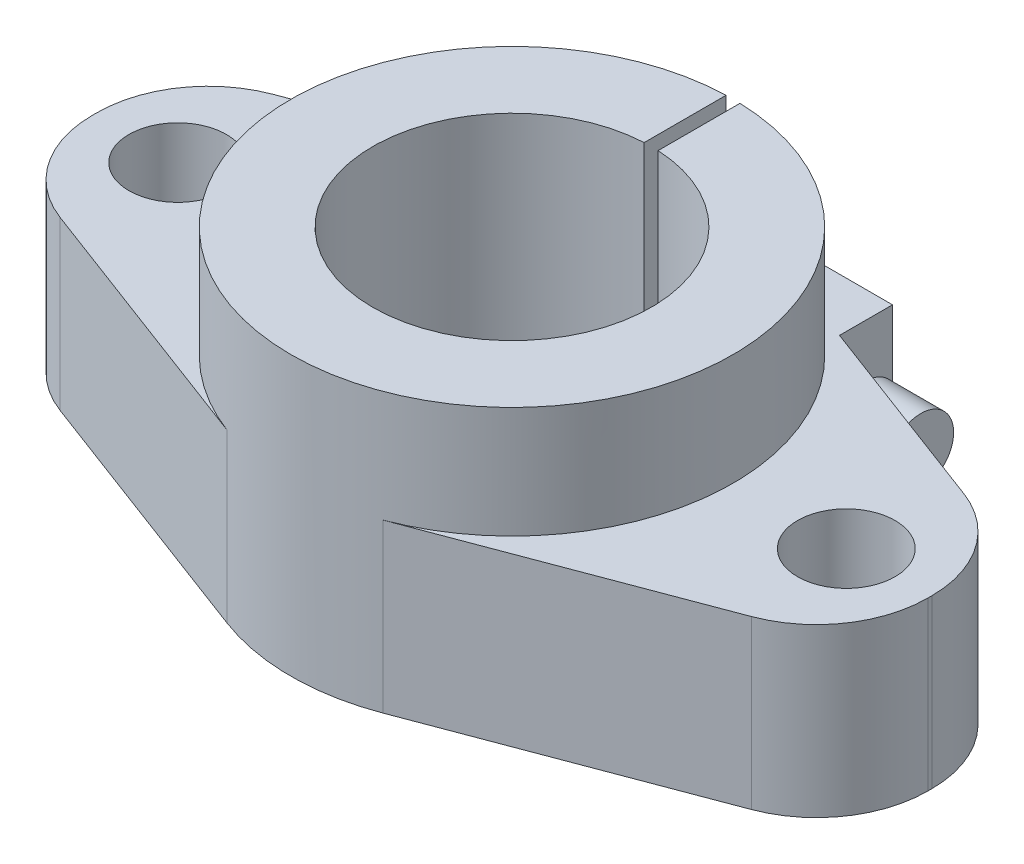
ISO-10303-21;
HEADER;
FILE_DESCRIPTION(('STEP AP214'),'2;1');
FILE_NAME('part.step','',(''),(''),'','','');
FILE_SCHEMA(('AUTOMOTIVE_DESIGN { 1 0 10303 214 1 1 1 1 }'));
ENDSEC;
DATA;
#1=APPLICATION_CONTEXT('core data for automotive mechanical design processes');
#2=APPLICATION_PROTOCOL_DEFINITION('international standard','automotive_design',2000,#1);
#3=PRODUCT_CONTEXT('',#1,'mechanical');
#4=PRODUCT('Part','Part','',(#3));
#5=PRODUCT_RELATED_PRODUCT_CATEGORY('part','',(#4));
#6=PRODUCT_DEFINITION_FORMATION('','',#4);
#7=PRODUCT_DEFINITION_CONTEXT('part definition',#1,'design');
#8=PRODUCT_DEFINITION('design','',#6,#7);
#9=PRODUCT_DEFINITION_SHAPE('','',#8);
#10=(LENGTH_UNIT() NAMED_UNIT(*) SI_UNIT(.MILLI.,.METRE.));
#11=(NAMED_UNIT(*) PLANE_ANGLE_UNIT() SI_UNIT($,.RADIAN.));
#12=(NAMED_UNIT(*) SI_UNIT($,.STERADIAN.) SOLID_ANGLE_UNIT());
#13=UNCERTAINTY_MEASURE_WITH_UNIT(LENGTH_MEASURE(1.E-05),#10,'distance_accuracy_value','');
#14=(GEOMETRIC_REPRESENTATION_CONTEXT(3) GLOBAL_UNCERTAINTY_ASSIGNED_CONTEXT((#13)) GLOBAL_UNIT_ASSIGNED_CONTEXT((#10,
#11,#12)) REPRESENTATION_CONTEXT('',''));
#15=CARTESIAN_POINT('',(0.,0.,0.));
#16=DIRECTION('',(0.,0.,1.));
#17=DIRECTION('',(1.,0.,0.));
#18=AXIS2_PLACEMENT_3D('',#15,#16,#17);
#19=CARTESIAN_POINT('',(5.58771941427111,12.,-14.859757658768));
#20=DIRECTION('',(-0.351968791720276,0.,0.936011735853226));
#21=DIRECTION('',(0.936011735853226,0.,0.351968791720276));
#22=AXIS2_PLACEMENT_3D('',#19,#20,#21);
#23=PLANE('',#22);
#24=CARTESIAN_POINT('',(5.62696028074298,5.86728456422639,-14.8450019032265));
#25=DIRECTION('',(-0.351968791720276,0.,0.936011735853226));
#26=DIRECTION('',(-0.936011735853226,0.,-0.351968791720276));
#27=AXIS2_PLACEMENT_3D('',#24,#25,#26);
#28=ELLIPSE('',#27,6.70619335587779,2.36037077251084);
#29=CARTESIAN_POINT('',(10.4988203862888,7.35565504603659,-13.0130347930961));
#30=VERTEX_POINT('',#29);
#31=CARTESIAN_POINT('',(10.4988203862888,4.3789140824162,-13.0130347930961));
#32=VERTEX_POINT('',#31);
#33=EDGE_CURVE('E316',#30,#32,#28,.F.);
#34=ORIENTED_EDGE('',*,*,#33,.F.);
#35=DIRECTION('',(0.,-1.,0.));
#36=VECTOR('',#35,1.);
#37=CARTESIAN_POINT('',(10.4988203862888,12.,-13.0130347930961));
#38=LINE('',#37,#36);
#39=CARTESIAN_POINT('',(10.4988203862888,12.,-13.0130347930961));
#40=VERTEX_POINT('',#39);
#41=EDGE_CURVE('E205',#40,#30,#38,.T.);
#42=ORIENTED_EDGE('',*,*,#41,.F.);
#43=DIRECTION('',(-0.936011735853226,0.,-0.351968791720276));
#44=VECTOR('',#43,1.);
#45=CARTESIAN_POINT('',(5.58771941427111,12.,-14.859757658768));
#46=LINE('',#45,#44);
#47=CARTESIAN_POINT('',(24.8157503337622,12.,-7.62943505632293));
#48=VERTEX_POINT('',#47);
#49=EDGE_CURVE('E418',#48,#40,#46,.T.);
#50=ORIENTED_EDGE('',*,*,#49,.F.);
#51=DIRECTION('',(0.,-1.,0.));
#52=VECTOR('',#51,1.);
#53=CARTESIAN_POINT('',(24.8157503337622,12.,-7.62943505632293));
#54=LINE('',#53,#52);
#55=CARTESIAN_POINT('',(24.8157503337622,0.,-7.62943505632293));
#56=VERTEX_POINT('',#55);
#57=EDGE_CURVE('E381',#48,#56,#54,.T.);
#58=ORIENTED_EDGE('',*,*,#57,.T.);
#59=DIRECTION('',(-0.936011735853226,0.,-0.351968791720276));
#60=VECTOR('',#59,1.);
#61=CARTESIAN_POINT('',(5.58771941427111,0.,-14.859757658768));
#62=LINE('',#61,#60);
#63=CARTESIAN_POINT('',(10.4988203862888,0.,-13.0130347930961));
#64=VERTEX_POINT('',#63);
#65=EDGE_CURVE('E255',#56,#64,#62,.T.);
#66=ORIENTED_EDGE('',*,*,#65,.T.);
#67=EDGE_CURVE('E213',#32,#64,#38,.T.);
#68=ORIENTED_EDGE('',*,*,#67,.F.);
#69=EDGE_LOOP('',(#34,#42,#50,#58,#66,#68));
#70=FACE_BOUND('',#69,.T.);
#71=ADVANCED_FACE('F34',(#70),#23,.F.);
#72=CARTESIAN_POINT('',(10.4988203862888,12.,0.));
#73=DIRECTION('',(1.,0.,0.));
#74=DIRECTION('',(0.,0.,-1.));
#75=AXIS2_PLACEMENT_3D('',#72,#73,#74);
#76=PLANE('',#75);
#77=DIRECTION('',(0.,-1.,0.));
#78=VECTOR('',#77,1.);
#79=CARTESIAN_POINT('',(10.4988203862888,12.,-16.8162644471082));
#80=LINE('',#79,#78);
#81=CARTESIAN_POINT('',(10.4988203862888,4.56902643626694,-16.8162644471082));
#82=VERTEX_POINT('',#81);
#83=CARTESIAN_POINT('',(10.4988203862888,0.,-16.8162644471082));
#84=VERTEX_POINT('',#83);
#85=EDGE_CURVE('E192',#82,#84,#80,.T.);
#86=ORIENTED_EDGE('',*,*,#85,.F.);
#87=CARTESIAN_POINT('',(10.4988203862888,5.86728456422639,-14.8450019032265));
#88=DIRECTION('',(1.,0.,0.));
#89=DIRECTION('',(0.,0.,-1.));
#90=AXIS2_PLACEMENT_3D('',#87,#88,#89);
#91=CIRCLE('',#90,2.36037077251084);
#92=EDGE_CURVE('E49',#32,#82,#91,.T.);
#93=ORIENTED_EDGE('',*,*,#92,.F.);
#94=ORIENTED_EDGE('',*,*,#67,.T.);
#95=DIRECTION('',(0.,0.,1.));
#96=VECTOR('',#95,1.);
#97=CARTESIAN_POINT('',(10.4988203862888,0.,0.));
#98=LINE('',#97,#96);
#99=EDGE_CURVE('E252',#84,#64,#98,.T.);
#100=ORIENTED_EDGE('',*,*,#99,.F.);
#101=EDGE_LOOP('',(#86,#93,#94,#100));
#102=FACE_BOUND('',#101,.T.);
#103=ADVANCED_FACE('F465',(#102),#76,.T.);
#104=ORIENTED_EDGE('',*,*,#41,.T.);
#105=CARTESIAN_POINT('',(10.4988203862888,7.16554269218584,-16.8162644471082));
#106=VERTEX_POINT('',#105);
#107=EDGE_CURVE('E196',#106,#30,#91,.T.);
#108=ORIENTED_EDGE('',*,*,#107,.F.);
#109=CARTESIAN_POINT('',(10.4988203862888,12.,-16.8162644471082));
#110=VERTEX_POINT('',#109);
#111=EDGE_CURVE('E191',#110,#106,#80,.T.);
#112=ORIENTED_EDGE('',*,*,#111,.F.);
#113=DIRECTION('',(0.,0.,1.));
#114=VECTOR('',#113,1.);
#115=CARTESIAN_POINT('',(10.4988203862888,12.,0.));
#116=LINE('',#115,#114);
#117=EDGE_CURVE('E420',#110,#40,#116,.T.);
#118=ORIENTED_EDGE('',*,*,#117,.T.);
#119=EDGE_LOOP('',(#104,#108,#112,#118));
#120=FACE_BOUND('',#119,.T.);
#121=ADVANCED_FACE('F201',(#120),#76,.T.);
#122=CARTESIAN_POINT('',(0.,12.,0.));
#123=DIRECTION('',(0.,1.,0.));
#124=DIRECTION('',(0.,0.,1.));
#125=AXIS2_PLACEMENT_3D('',#122,#123,#124);
#126=PLANE('',#125);
#127=DIRECTION('',(0.,0.,-1.));
#128=VECTOR('',#127,1.);
#129=CARTESIAN_POINT('',(-30.,12.,0.));
#130=LINE('',#129,#128);
#131=CARTESIAN_POINT('',(-30.,12.,0.140757034775283));
#132=VERTEX_POINT('',#131);
#133=CARTESIAN_POINT('',(-30.,12.,-0.182302427989566));
#134=VERTEX_POINT('',#133);
#135=EDGE_CURVE('E398',#132,#134,#130,.T.);
#136=ORIENTED_EDGE('',*,*,#135,.F.);
#137=CARTESIAN_POINT('',(-22.,12.,0.140757034775283));
#138=DIRECTION('',(0.,1.,0.));
#139=DIRECTION('',(0.,0.,1.));
#140=AXIS2_PLACEMENT_3D('',#137,#138,#139);
#141=CIRCLE('',#140,8.);
#142=CARTESIAN_POINT('',(-24.8159496339808,12.,7.62877597564898));
#143=VERTEX_POINT('',#142);
#144=EDGE_CURVE('E42',#132,#143,#141,.T.);
#145=ORIENTED_EDGE('',*,*,#144,.T.);
#146=DIRECTION('',(-0.936002367609212,0.,-0.351993704247604));
#147=VECTOR('',#146,1.);
#148=CARTESIAN_POINT('',(-5.58811491584933,12.,14.8596089321758));
#149=LINE('',#148,#147);
#150=CARTESIAN_POINT('',(-5.58811491584933,12.,14.8596089321758));
#151=VERTEX_POINT('',#150);
#152=EDGE_CURVE('E377',#151,#143,#149,.T.);
#153=ORIENTED_EDGE('',*,*,#152,.F.);
#154=CARTESIAN_POINT('',(0.,12.,0.));
#155=DIRECTION('',(0.,1.,0.));
#156=DIRECTION('',(0.,0.,1.));
#157=AXIS2_PLACEMENT_3D('',#154,#155,#156);
#158=CIRCLE('',#157,15.8756104112546);
#159=CARTESIAN_POINT('',(-0.5,12.,-15.867734744756));
#160=VERTEX_POINT('',#159);
#161=EDGE_CURVE('E311',#160,#151,#158,.T.);
#162=ORIENTED_EDGE('',*,*,#161,.F.);
#163=DIRECTION('',(0.,0.,1.));
#164=VECTOR('',#163,1.);
#165=CARTESIAN_POINT('',(-0.5,12.,0.));
#166=LINE('',#165,#164);
#167=CARTESIAN_POINT('',(-0.5,12.,-16.8162644471082));
#168=VERTEX_POINT('',#167);
#169=EDGE_CURVE('E285',#168,#160,#166,.T.);
#170=ORIENTED_EDGE('',*,*,#169,.F.);
#171=DIRECTION('',(-1.,0.,0.));
#172=VECTOR('',#171,1.);
#173=CARTESIAN_POINT('',(0.,12.,-16.8162644471082));
#174=LINE('',#173,#172);
#175=CARTESIAN_POINT('',(-10.5,12.,-16.8162644471082));
#176=VERTEX_POINT('',#175);
#177=EDGE_CURVE('E283',#168,#176,#174,.T.);
#178=ORIENTED_EDGE('',*,*,#177,.T.);
#179=DIRECTION('',(0.,0.,1.));
#180=VECTOR('',#179,1.);
#181=CARTESIAN_POINT('',(-10.5,12.,0.));
#182=LINE('',#181,#180);
#183=CARTESIAN_POINT('',(-10.5,12.,-13.0230815952437));
#184=VERTEX_POINT('',#183);
#185=EDGE_CURVE('E234',#176,#184,#182,.T.);
#186=ORIENTED_EDGE('',*,*,#185,.T.);
#187=DIRECTION('',(-0.93666723836858,0.,0.350220622703715));
#188=VECTOR('',#187,1.);
#189=CARTESIAN_POINT('',(-5.55996616403117,12.,-14.8701641613253));
#190=LINE('',#189,#188);
#191=CARTESIAN_POINT('',(-24.8017649816297,12.,-7.6756403349382));
#192=VERTEX_POINT('',#191);
#193=EDGE_CURVE('E411',#184,#192,#190,.T.);
#194=ORIENTED_EDGE('',*,*,#193,.T.);
#195=CARTESIAN_POINT('',(-22.,12.,-0.182302427989566));
#196=DIRECTION('',(0.,1.,0.));
#197=DIRECTION('',(0.,0.,1.));
#198=AXIS2_PLACEMENT_3D('',#195,#196,#197);
#199=CIRCLE('',#198,8.);
#200=EDGE_CURVE('E392',#192,#134,#199,.T.);
#201=ORIENTED_EDGE('',*,*,#200,.T.);
#202=EDGE_LOOP('',(#136,#145,#153,#162,#170,#178,#186,#194,#201));
#203=FACE_BOUND('',#202,.T.);
#204=CARTESIAN_POINT('',(-24.,12.,0.));
#205=DIRECTION('',(0.,1.,0.));
#206=DIRECTION('',(0.,0.,1.));
#207=AXIS2_PLACEMENT_3D('',#204,#205,#206);
#208=CIRCLE('',#207,3.5);
#209=CARTESIAN_POINT('',(-24.,12.,3.5));
#210=VERTEX_POINT('',#209);
#211=EDGE_CURVE('E230',#210,#210,#208,.T.);
#212=ORIENTED_EDGE('',*,*,#211,.F.);
#213=EDGE_LOOP('',(#212));
#214=FACE_BOUND('',#213,.T.);
#215=ADVANCED_FACE('F395',(#203,#214),#126,.T.);
#216=CARTESIAN_POINT('',(-10.5,12.,0.));
#217=DIRECTION('',(1.,0.,0.));
#218=DIRECTION('',(0.,0.,-1.));
#219=AXIS2_PLACEMENT_3D('',#216,#217,#218);
#220=PLANE('',#219);
#221=DIRECTION('',(0.,0.,1.));
#222=VECTOR('',#221,1.);
#223=CARTESIAN_POINT('',(-10.5,0.,0.));
#224=LINE('',#223,#222);
#225=CARTESIAN_POINT('',(-10.5,0.,-16.8162644471082));
#226=VERTEX_POINT('',#225);
#227=CARTESIAN_POINT('',(-10.5,0.,-13.0230815952437));
#228=VERTEX_POINT('',#227);
#229=EDGE_CURVE('E274',#226,#228,#224,.T.);
#230=ORIENTED_EDGE('',*,*,#229,.T.);
#231=DIRECTION('',(0.,-1.,0.));
#232=VECTOR('',#231,1.);
#233=CARTESIAN_POINT('',(-10.5,12.,-13.0230815952437));
#234=LINE('',#233,#232);
#235=EDGE_CURVE('E301',#184,#228,#234,.T.);
#236=ORIENTED_EDGE('',*,*,#235,.F.);
#237=ORIENTED_EDGE('',*,*,#185,.F.);
#238=DIRECTION('',(0.,-1.,0.));
#239=VECTOR('',#238,1.);
#240=CARTESIAN_POINT('',(-10.5,12.,-16.8162644471082));
#241=LINE('',#240,#239);
#242=EDGE_CURVE('E227',#176,#226,#241,.T.);
#243=ORIENTED_EDGE('',*,*,#242,.T.);
#244=EDGE_LOOP('',(#230,#236,#237,#243));
#245=FACE_BOUND('',#244,.T.);
#246=ADVANCED_FACE('F488',(#245),#220,.F.);
#247=CARTESIAN_POINT('',(-5.55996616403117,12.,-14.8701641613253));
#248=DIRECTION('',(0.350220622703715,0.,0.93666723836858));
#249=DIRECTION('',(0.93666723836858,0.,-0.350220622703715));
#250=AXIS2_PLACEMENT_3D('',#247,#248,#249);
#251=PLANE('',#250);
#252=DIRECTION('',(-0.93666723836858,0.,0.350220622703715));
#253=VECTOR('',#252,1.);
#254=CARTESIAN_POINT('',(-5.55996616403117,0.,-14.8701641613253));
#255=LINE('',#254,#253);
#256=CARTESIAN_POINT('',(-24.8017649816297,0.,-7.6756403349382));
#257=VERTEX_POINT('',#256);
#258=EDGE_CURVE('E272',#228,#257,#255,.T.);
#259=ORIENTED_EDGE('',*,*,#258,.T.);
#260=DIRECTION('',(0.,-1.,0.));
#261=VECTOR('',#260,1.);
#262=CARTESIAN_POINT('',(-24.8017649816297,12.,-7.67564033493821));
#263=LINE('',#262,#261);
#264=EDGE_CURVE('E11',#257,#192,#263,.F.);
#265=ORIENTED_EDGE('',*,*,#264,.T.);
#266=ORIENTED_EDGE('',*,*,#193,.F.);
#267=ORIENTED_EDGE('',*,*,#235,.T.);
#268=EDGE_LOOP('',(#259,#265,#266,#267));
#269=FACE_BOUND('',#268,.T.);
#270=ADVANCED_FACE('F407',(#269),#251,.F.);
#271=CARTESIAN_POINT('',(-30.,12.,0.));
#272=DIRECTION('',(-1.,0.,0.));
#273=DIRECTION('',(0.,0.,1.));
#274=AXIS2_PLACEMENT_3D('',#271,#272,#273);
#275=PLANE('',#274);
#276=DIRECTION('',(0.,0.,-1.));
#277=VECTOR('',#276,1.);
#278=CARTESIAN_POINT('',(-30.,0.,0.));
#279=LINE('',#278,#277);
#280=CARTESIAN_POINT('',(-30.,0.,0.140757034775283));
#281=VERTEX_POINT('',#280);
#282=CARTESIAN_POINT('',(-30.,0.,-0.182302427989566));
#283=VERTEX_POINT('',#282);
#284=EDGE_CURVE('E269',#281,#283,#279,.T.);
#285=ORIENTED_EDGE('',*,*,#284,.F.);
#286=DIRECTION('',(0.,-1.,0.));
#287=VECTOR('',#286,1.);
#288=CARTESIAN_POINT('',(-30.,12.,0.140757034775283));
#289=LINE('',#288,#287);
#290=EDGE_CURVE('E384',#281,#132,#289,.F.);
#291=ORIENTED_EDGE('',*,*,#290,.T.);
#292=ORIENTED_EDGE('',*,*,#135,.T.);
#293=DIRECTION('',(0.,-1.,0.));
#294=VECTOR('',#293,1.);
#295=CARTESIAN_POINT('',(-30.,0.,-0.182302427989566));
#296=LINE('',#295,#294);
#297=EDGE_CURVE('E380',#134,#283,#296,.T.);
#298=ORIENTED_EDGE('',*,*,#297,.T.);
#299=EDGE_LOOP('',(#285,#291,#292,#298));
#300=FACE_BOUND('',#299,.T.);
#301=ADVANCED_FACE('F403',(#300),#275,.T.);
#302=CARTESIAN_POINT('',(-5.58811491584933,12.,14.8596089321758));
#303=DIRECTION('',(-0.351993704247604,0.,0.936002367609212));
#304=DIRECTION('',(0.936002367609212,0.,0.351993704247604));
#305=AXIS2_PLACEMENT_3D('',#302,#303,#304);
#306=PLANE('',#305);
#307=ORIENTED_EDGE('',*,*,#152,.T.);
#308=DIRECTION('',(0.,-1.,0.));
#309=VECTOR('',#308,1.);
#310=CARTESIAN_POINT('',(-24.8159496339808,12.,7.62877597564898));
#311=LINE('',#310,#309);
#312=CARTESIAN_POINT('',(-24.8159496339808,0.,7.62877597564898));
#313=VERTEX_POINT('',#312);
#314=EDGE_CURVE('E376',#143,#313,#311,.T.);
#315=ORIENTED_EDGE('',*,*,#314,.T.);
#316=DIRECTION('',(-0.936002367609212,0.,-0.351993704247604));
#317=VECTOR('',#316,1.);
#318=CARTESIAN_POINT('',(-5.58811491584933,0.,14.8596089321758));
#319=LINE('',#318,#317);
#320=CARTESIAN_POINT('',(-5.58200011721561,0.,14.8619077496465));
#321=VERTEX_POINT('',#320);
#322=EDGE_CURVE('E266',#321,#313,#319,.T.);
#323=ORIENTED_EDGE('',*,*,#322,.F.);
#324=DIRECTION('',(0.,-1.,0.));
#325=VECTOR('',#324,1.);
#326=CARTESIAN_POINT('',(-5.58200011721561,12.,14.8619077496465));
#327=LINE('',#326,#325);
#328=CARTESIAN_POINT('',(-5.58200011721561,12.,14.8619077496465));
#329=VERTEX_POINT('',#328);
#330=EDGE_CURVE('E348',#329,#321,#327,.T.);
#331=ORIENTED_EDGE('',*,*,#330,.F.);
#332=EDGE_CURVE('E317',#329,#151,#149,.T.);
#333=ORIENTED_EDGE('',*,*,#332,.T.);
#334=EDGE_LOOP('',(#307,#315,#323,#331,#333));
#335=FACE_BOUND('',#334,.T.);
#336=ADVANCED_FACE('F373',(#335),#306,.T.);
#337=CARTESIAN_POINT('',(0.,12.,0.));
#338=DIRECTION('',(0.,-1.,0.));
#339=DIRECTION('',(0.,0.,-1.));
#340=AXIS2_PLACEMENT_3D('',#337,#338,#339);
#341=CYLINDRICAL_SURFACE('',#340,15.8756104112546);
#342=CARTESIAN_POINT('',(0.,0.,0.));
#343=DIRECTION('',(0.,1.,0.));
#344=DIRECTION('',(0.,0.,1.));
#345=AXIS2_PLACEMENT_3D('',#342,#343,#344);
#346=CIRCLE('',#345,15.8756104112546);
#347=CARTESIAN_POINT('',(5.58811491584933,0.,14.8596089321758));
#348=VERTEX_POINT('',#347);
#349=EDGE_CURVE('E263',#321,#348,#346,.T.);
#350=ORIENTED_EDGE('',*,*,#349,.T.);
#351=DIRECTION('',(0.,-1.,0.));
#352=VECTOR('',#351,1.);
#353=CARTESIAN_POINT('',(5.58811491584933,12.,14.8596089321758));
#354=LINE('',#353,#352);
#355=CARTESIAN_POINT('',(5.58811491584933,12.,14.8596089321758));
#356=VERTEX_POINT('',#355);
#357=EDGE_CURVE('E349',#356,#348,#354,.T.);
#358=ORIENTED_EDGE('',*,*,#357,.F.);
#359=CARTESIAN_POINT('',(0.5,12.,-15.867735080936));
#360=VERTEX_POINT('',#359);
#361=EDGE_CURVE('E296',#356,#360,#158,.T.);
#362=ORIENTED_EDGE('',*,*,#361,.T.);
#363=DIRECTION('',(0.,-1.,0.));
#364=VECTOR('',#363,1.);
#365=CARTESIAN_POINT('',(0.5,20.,-15.867735080936));
#366=LINE('',#365,#364);
#367=CARTESIAN_POINT('',(0.5,20.,-15.867735080936));
#368=VERTEX_POINT('',#367);
#369=EDGE_CURVE('E277',#368,#360,#366,.T.);
#370=ORIENTED_EDGE('',*,*,#369,.F.);
#371=CARTESIAN_POINT('',(0.,20.,0.));
#372=DIRECTION('',(0.,1.,0.));
#373=DIRECTION('',(0.,0.,1.));
#374=AXIS2_PLACEMENT_3D('',#371,#372,#373);
#375=CIRCLE('',#374,15.8756104112546);
#376=CARTESIAN_POINT('',(-0.5,20.,-15.867735080936));
#377=VERTEX_POINT('',#376);
#378=EDGE_CURVE('E315',#377,#368,#375,.T.);
#379=ORIENTED_EDGE('',*,*,#378,.F.);
#380=DIRECTION('',(0.,-1.,0.));
#381=VECTOR('',#380,1.);
#382=CARTESIAN_POINT('',(-0.5,20.,-15.867735080936));
#383=LINE('',#382,#381);
#384=EDGE_CURVE('E320',#377,#160,#383,.T.);
#385=ORIENTED_EDGE('',*,*,#384,.T.);
#386=ORIENTED_EDGE('',*,*,#161,.T.);
#387=ORIENTED_EDGE('',*,*,#332,.F.);
#388=ORIENTED_EDGE('',*,*,#330,.T.);
#389=EDGE_LOOP('',(#350,#358,#362,#370,#379,#385,#386,#387,#388));
#390=FACE_BOUND('',#389,.T.);
#391=ADVANCED_FACE('F364',(#390),#341,.T.);
#392=CARTESIAN_POINT('',(5.58811491584933,12.,14.8596089321758));
#393=DIRECTION('',(0.351993704247604,0.,0.936002367609212));
#394=DIRECTION('',(0.936002367609212,0.,-0.351993704247604));
#395=AXIS2_PLACEMENT_3D('',#392,#393,#394);
#396=PLANE('',#395);
#397=DIRECTION('',(-0.936002367609212,0.,0.351993704247604));
#398=VECTOR('',#397,1.);
#399=CARTESIAN_POINT('',(5.58811491584933,0.,14.8596089321758));
#400=LINE('',#399,#398);
#401=CARTESIAN_POINT('',(24.8159496339808,0.,7.62877597564898));
#402=VERTEX_POINT('',#401);
#403=EDGE_CURVE('E261',#402,#348,#400,.T.);
#404=ORIENTED_EDGE('',*,*,#403,.F.);
#405=DIRECTION('',(0.,-1.,0.));
#406=VECTOR('',#405,1.);
#407=CARTESIAN_POINT('',(24.8159496339808,12.,7.62877597564898));
#408=LINE('',#407,#406);
#409=CARTESIAN_POINT('',(24.8159496339808,12.,7.62877597564898));
#410=VERTEX_POINT('',#409);
#411=EDGE_CURVE('E337',#402,#410,#408,.F.);
#412=ORIENTED_EDGE('',*,*,#411,.T.);
#413=DIRECTION('',(-0.936002367609212,0.,0.351993704247604));
#414=VECTOR('',#413,1.);
#415=CARTESIAN_POINT('',(5.58811491584933,12.,14.8596089321758));
#416=LINE('',#415,#414);
#417=EDGE_CURVE('E338',#410,#356,#416,.T.);
#418=ORIENTED_EDGE('',*,*,#417,.T.);
#419=ORIENTED_EDGE('',*,*,#357,.T.);
#420=EDGE_LOOP('',(#404,#412,#418,#419));
#421=FACE_BOUND('',#420,.T.);
#422=ADVANCED_FACE('F360',(#421),#396,.T.);
#423=CARTESIAN_POINT('',(30.,12.,0.));
#424=DIRECTION('',(-1.,0.,0.));
#425=DIRECTION('',(0.,0.,1.));
#426=AXIS2_PLACEMENT_3D('',#423,#424,#425);
#427=PLANE('',#426);
#428=DIRECTION('',(0.,0.,-1.));
#429=VECTOR('',#428,1.);
#430=CARTESIAN_POINT('',(30.,12.,0.));
#431=LINE('',#430,#429);
#432=CARTESIAN_POINT('',(30.,12.,0.140757034775282));
#433=VERTEX_POINT('',#432);
#434=CARTESIAN_POINT('',(30.,12.,-0.141341169497128));
#435=VERTEX_POINT('',#434);
#436=EDGE_CURVE('E341',#433,#435,#431,.T.);
#437=ORIENTED_EDGE('',*,*,#436,.F.);
#438=DIRECTION('',(0.,-1.,0.));
#439=VECTOR('',#438,1.);
#440=CARTESIAN_POINT('',(30.,0.,0.140757034775282));
#441=LINE('',#440,#439);
#442=CARTESIAN_POINT('',(30.,0.,0.140757034775282));
#443=VERTEX_POINT('',#442);
#444=EDGE_CURVE('E326',#433,#443,#441,.T.);
#445=ORIENTED_EDGE('',*,*,#444,.T.);
#446=DIRECTION('',(0.,0.,-1.));
#447=VECTOR('',#446,1.);
#448=CARTESIAN_POINT('',(30.,0.,0.));
#449=LINE('',#448,#447);
#450=CARTESIAN_POINT('',(30.,0.,-0.141341169497128));
#451=VERTEX_POINT('',#450);
#452=EDGE_CURVE('E258',#443,#451,#449,.T.);
#453=ORIENTED_EDGE('',*,*,#452,.T.);
#454=DIRECTION('',(0.,-1.,0.));
#455=VECTOR('',#454,1.);
#456=CARTESIAN_POINT('',(30.,12.,-0.141341169497128));
#457=LINE('',#456,#455);
#458=EDGE_CURVE('E300',#451,#435,#457,.F.);
#459=ORIENTED_EDGE('',*,*,#458,.T.);
#460=EDGE_LOOP('',(#437,#445,#453,#459));
#461=FACE_BOUND('',#460,.T.);
#462=ADVANCED_FACE('F459',(#461),#427,.F.);
#463=CARTESIAN_POINT('',(0.,12.,-16.8162644471082));
#464=DIRECTION('',(0.,0.,-1.));
#465=DIRECTION('',(-1.,0.,0.));
#466=AXIS2_PLACEMENT_3D('',#463,#464,#465);
#467=PLANE('',#466);
#468=DIRECTION('',(1.,0.,0.));
#469=VECTOR('',#468,1.);
#470=CARTESIAN_POINT('',(0.,0.,-16.8162644471082));
#471=LINE('',#470,#469);
#472=CARTESIAN_POINT('',(0.5,0.,-16.8162644471082));
#473=VERTEX_POINT('',#472);
#474=EDGE_CURVE('E249',#473,#84,#471,.T.);
#475=ORIENTED_EDGE('',*,*,#474,.F.);
#476=DIRECTION('',(0.,-1.,0.));
#477=VECTOR('',#476,1.);
#478=CARTESIAN_POINT('',(0.5,12.,-16.8162644471082));
#479=LINE('',#478,#477);
#480=CARTESIAN_POINT('',(0.5,12.,-16.8162644471082));
#481=VERTEX_POINT('',#480);
#482=EDGE_CURVE('E216',#481,#473,#479,.T.);
#483=ORIENTED_EDGE('',*,*,#482,.F.);
#484=DIRECTION('',(1.,0.,0.));
#485=VECTOR('',#484,1.);
#486=CARTESIAN_POINT('',(0.,12.,-16.8162644471082));
#487=LINE('',#486,#485);
#488=EDGE_CURVE('E212',#481,#110,#487,.T.);
#489=ORIENTED_EDGE('',*,*,#488,.T.);
#490=ORIENTED_EDGE('',*,*,#111,.T.);
#491=EDGE_CURVE('E185',#106,#82,#80,.T.);
#492=ORIENTED_EDGE('',*,*,#491,.T.);
#493=ORIENTED_EDGE('',*,*,#85,.T.);
#494=EDGE_LOOP('',(#475,#483,#489,#490,#492,#493));
#495=FACE_BOUND('',#494,.T.);
#496=ADVANCED_FACE('F209',(#495),#467,.T.);
#497=CARTESIAN_POINT('',(0.5,12.,0.));
#498=DIRECTION('',(-1.,0.,0.));
#499=DIRECTION('',(0.,0.,1.));
#500=AXIS2_PLACEMENT_3D('',#497,#498,#499);
#501=PLANE('',#500);
#502=DIRECTION('',(0.,0.,-1.));
#503=VECTOR('',#502,1.);
#504=CARTESIAN_POINT('',(0.5,0.,0.));
#505=LINE('',#504,#503);
#506=CARTESIAN_POINT('',(0.5,0.,-9.98749217771909));
#507=VERTEX_POINT('',#506);
#508=EDGE_CURVE('E246',#507,#473,#505,.T.);
#509=ORIENTED_EDGE('',*,*,#508,.F.);
#510=DIRECTION('',(0.,-1.,0.));
#511=VECTOR('',#510,1.);
#512=CARTESIAN_POINT('',(0.5,12.,-9.98749217771909));
#513=LINE('',#512,#511);
#514=CARTESIAN_POINT('',(0.499999999999997,20.,-9.98749217771909));
#515=VERTEX_POINT('',#514);
#516=EDGE_CURVE('E218',#515,#507,#513,.T.);
#517=ORIENTED_EDGE('',*,*,#516,.F.);
#518=DIRECTION('',(0.,0.,1.));
#519=VECTOR('',#518,1.);
#520=CARTESIAN_POINT('',(0.5,20.,0.));
#521=LINE('',#520,#519);
#522=EDGE_CURVE('E439',#368,#515,#521,.T.);
#523=ORIENTED_EDGE('',*,*,#522,.F.);
#524=ORIENTED_EDGE('',*,*,#369,.T.);
#525=DIRECTION('',(0.,0.,-1.));
#526=VECTOR('',#525,1.);
#527=CARTESIAN_POINT('',(0.5,12.,0.));
#528=LINE('',#527,#526);
#529=EDGE_CURVE('E294',#360,#481,#528,.T.);
#530=ORIENTED_EDGE('',*,*,#529,.T.);
#531=ORIENTED_EDGE('',*,*,#482,.T.);
#532=EDGE_LOOP('',(#509,#517,#523,#524,#530,#531));
#533=FACE_BOUND('',#532,.T.);
#534=ADVANCED_FACE('F422',(#533),#501,.T.);
#535=CARTESIAN_POINT('',(0.,12.,0.));
#536=DIRECTION('',(0.,-1.,0.));
#537=DIRECTION('',(0.,0.,-1.));
#538=AXIS2_PLACEMENT_3D('',#535,#536,#537);
#539=CYLINDRICAL_SURFACE('',#538,10.);
#540=CARTESIAN_POINT('',(0.,0.,0.));
#541=DIRECTION('',(0.,1.,0.));
#542=DIRECTION('',(0.,0.,1.));
#543=AXIS2_PLACEMENT_3D('',#540,#541,#542);
#544=CIRCLE('',#543,10.);
#545=CARTESIAN_POINT('',(-0.5,0.,-9.98749217771909));
#546=VERTEX_POINT('',#545);
#547=EDGE_CURVE('E243',#546,#507,#544,.T.);
#548=ORIENTED_EDGE('',*,*,#547,.F.);
#549=DIRECTION('',(0.,-1.,0.));
#550=VECTOR('',#549,1.);
#551=CARTESIAN_POINT('',(-0.5,12.,-9.98749217771909));
#552=LINE('',#551,#550);
#553=CARTESIAN_POINT('',(-0.5,20.,-9.98749217771909));
#554=VERTEX_POINT('',#553);
#555=EDGE_CURVE('E221',#554,#546,#552,.T.);
#556=ORIENTED_EDGE('',*,*,#555,.F.);
#557=CARTESIAN_POINT('',(0.,20.,0.));
#558=DIRECTION('',(0.,1.,0.));
#559=DIRECTION('',(0.,0.,1.));
#560=AXIS2_PLACEMENT_3D('',#557,#558,#559);
#561=CIRCLE('',#560,10.);
#562=EDGE_CURVE('E441',#515,#554,#561,.F.);
#563=ORIENTED_EDGE('',*,*,#562,.F.);
#564=ORIENTED_EDGE('',*,*,#516,.T.);
#565=EDGE_LOOP('',(#548,#556,#563,#564));
#566=FACE_BOUND('',#565,.T.);
#567=ADVANCED_FACE('F533',(#566),#539,.F.);
#568=CARTESIAN_POINT('',(-0.5,12.,0.));
#569=DIRECTION('',(1.,0.,0.));
#570=DIRECTION('',(0.,0.,-1.));
#571=AXIS2_PLACEMENT_3D('',#568,#569,#570);
#572=PLANE('',#571);
#573=DIRECTION('',(0.,0.,1.));
#574=VECTOR('',#573,1.);
#575=CARTESIAN_POINT('',(-0.5,0.,0.));
#576=LINE('',#575,#574);
#577=CARTESIAN_POINT('',(-0.5,0.,-16.8162644471082));
#578=VERTEX_POINT('',#577);
#579=EDGE_CURVE('E240',#578,#546,#576,.T.);
#580=ORIENTED_EDGE('',*,*,#579,.F.);
#581=DIRECTION('',(0.,-1.,0.));
#582=VECTOR('',#581,1.);
#583=CARTESIAN_POINT('',(-0.5,12.,-16.8162644471082));
#584=LINE('',#583,#582);
#585=EDGE_CURVE('E225',#168,#578,#584,.T.);
#586=ORIENTED_EDGE('',*,*,#585,.F.);
#587=ORIENTED_EDGE('',*,*,#169,.T.);
#588=ORIENTED_EDGE('',*,*,#384,.F.);
#589=DIRECTION('',(0.,0.,-1.));
#590=VECTOR('',#589,1.);
#591=CARTESIAN_POINT('',(-0.5,20.,0.));
#592=LINE('',#591,#590);
#593=EDGE_CURVE('E306',#554,#377,#592,.T.);
#594=ORIENTED_EDGE('',*,*,#593,.F.);
#595=ORIENTED_EDGE('',*,*,#555,.T.);
#596=EDGE_LOOP('',(#580,#586,#587,#588,#594,#595));
#597=FACE_BOUND('',#596,.T.);
#598=ADVANCED_FACE('F451',(#597),#572,.T.);
#599=CARTESIAN_POINT('',(24.,12.,0.));
#600=DIRECTION('',(0.,-1.,0.));
#601=DIRECTION('',(0.,0.,-1.));
#602=AXIS2_PLACEMENT_3D('',#599,#600,#601);
#603=CYLINDRICAL_SURFACE('',#602,3.5);
#604=CARTESIAN_POINT('',(24.,12.,0.));
#605=DIRECTION('',(0.,1.,0.));
#606=DIRECTION('',(0.,0.,1.));
#607=AXIS2_PLACEMENT_3D('',#604,#605,#606);
#608=CIRCLE('',#607,3.5);
#609=CARTESIAN_POINT('',(24.,12.,3.5));
#610=VERTEX_POINT('',#609);
#611=EDGE_CURVE('E280',#610,#610,#608,.T.);
#612=ORIENTED_EDGE('',*,*,#611,.T.);
#613=EDGE_LOOP('',(#612));
#614=FACE_BOUND('',#613,.T.);
#615=CARTESIAN_POINT('',(24.,0.,0.));
#616=DIRECTION('',(0.,1.,0.));
#617=DIRECTION('',(0.,0.,1.));
#618=AXIS2_PLACEMENT_3D('',#615,#616,#617);
#619=CIRCLE('',#618,3.5);
#620=CARTESIAN_POINT('',(24.,0.,3.5));
#621=VERTEX_POINT('',#620);
#622=EDGE_CURVE('E235',#621,#621,#619,.T.);
#623=ORIENTED_EDGE('',*,*,#622,.F.);
#624=EDGE_LOOP('',(#623));
#625=FACE_BOUND('',#624,.T.);
#626=ADVANCED_FACE('F524',(#614,#625),#603,.F.);
#627=CARTESIAN_POINT('',(0.,12.,-16.8162644471082));
#628=DIRECTION('',(0.,0.,1.));
#629=DIRECTION('',(1.,0.,0.));
#630=AXIS2_PLACEMENT_3D('',#627,#628,#629);
#631=PLANE('',#630);
#632=DIRECTION('',(-1.,0.,0.));
#633=VECTOR('',#632,1.);
#634=CARTESIAN_POINT('',(0.,0.,-16.8162644471082));
#635=LINE('',#634,#633);
#636=EDGE_CURVE('E238',#578,#226,#635,.T.);
#637=ORIENTED_EDGE('',*,*,#636,.T.);
#638=ORIENTED_EDGE('',*,*,#242,.F.);
#639=ORIENTED_EDGE('',*,*,#177,.F.);
#640=ORIENTED_EDGE('',*,*,#585,.T.);
#641=EDGE_LOOP('',(#637,#638,#639,#640));
#642=FACE_BOUND('',#641,.T.);
#643=ADVANCED_FACE('F522',(#642),#631,.F.);
#644=CARTESIAN_POINT('',(-24.,12.,0.));
#645=DIRECTION('',(0.,-1.,0.));
#646=DIRECTION('',(0.,0.,-1.));
#647=AXIS2_PLACEMENT_3D('',#644,#645,#646);
#648=CYLINDRICAL_SURFACE('',#647,3.5);
#649=ORIENTED_EDGE('',*,*,#211,.T.);
#650=EDGE_LOOP('',(#649));
#651=FACE_BOUND('',#650,.T.);
#652=CARTESIAN_POINT('',(-24.,0.,0.));
#653=DIRECTION('',(0.,1.,0.));
#654=DIRECTION('',(0.,0.,1.));
#655=AXIS2_PLACEMENT_3D('',#652,#653,#654);
#656=CIRCLE('',#655,3.5);
#657=CARTESIAN_POINT('',(-24.,0.,3.5));
#658=VERTEX_POINT('',#657);
#659=EDGE_CURVE('E231',#658,#658,#656,.T.);
#660=ORIENTED_EDGE('',*,*,#659,.F.);
#661=EDGE_LOOP('',(#660));
#662=FACE_BOUND('',#661,.T.);
#663=ADVANCED_FACE('F517',(#651,#662),#648,.F.);
#664=ORIENTED_EDGE('',*,*,#417,.F.);
#665=CARTESIAN_POINT('',(22.,12.,0.140757034775282));
#666=DIRECTION('',(0.,1.,0.));
#667=DIRECTION('',(0.,0.,1.));
#668=AXIS2_PLACEMENT_3D('',#665,#666,#667);
#669=CIRCLE('',#668,8.);
#670=EDGE_CURVE('E387',#410,#433,#669,.T.);
#671=ORIENTED_EDGE('',*,*,#670,.T.);
#672=ORIENTED_EDGE('',*,*,#436,.T.);
#673=CARTESIAN_POINT('',(22.,12.,-0.141341169497128));
#674=DIRECTION('',(0.,1.,0.));
#675=DIRECTION('',(0.,0.,1.));
#676=AXIS2_PLACEMENT_3D('',#673,#674,#675);
#677=CIRCLE('',#676,8.);
#678=EDGE_CURVE('E429',#435,#48,#677,.T.);
#679=ORIENTED_EDGE('',*,*,#678,.T.);
#680=ORIENTED_EDGE('',*,*,#49,.T.);
#681=ORIENTED_EDGE('',*,*,#117,.F.);
#682=ORIENTED_EDGE('',*,*,#488,.F.);
#683=ORIENTED_EDGE('',*,*,#529,.F.);
#684=ORIENTED_EDGE('',*,*,#361,.F.);
#685=EDGE_LOOP('',(#664,#671,#672,#679,#680,#681,#682,#683,#684));
#686=FACE_BOUND('',#685,.T.);
#687=ORIENTED_EDGE('',*,*,#611,.F.);
#688=EDGE_LOOP('',(#687));
#689=FACE_BOUND('',#688,.T.);
#690=ADVANCED_FACE('F425',(#686,#689),#126,.T.);
#691=CARTESIAN_POINT('',(0.,0.,0.));
#692=DIRECTION('',(0.,1.,0.));
#693=DIRECTION('',(0.,0.,1.));
#694=AXIS2_PLACEMENT_3D('',#691,#692,#693);
#695=PLANE('',#694);
#696=ORIENTED_EDGE('',*,*,#452,.F.);
#697=CARTESIAN_POINT('',(22.,0.,0.140757034775282));
#698=DIRECTION('',(0.,1.,0.));
#699=DIRECTION('',(0.,0.,1.));
#700=AXIS2_PLACEMENT_3D('',#697,#698,#699);
#701=CIRCLE('',#700,8.);
#702=EDGE_CURVE('E335',#443,#402,#701,.F.);
#703=ORIENTED_EDGE('',*,*,#702,.T.);
#704=ORIENTED_EDGE('',*,*,#403,.T.);
#705=ORIENTED_EDGE('',*,*,#349,.F.);
#706=ORIENTED_EDGE('',*,*,#322,.T.);
#707=CARTESIAN_POINT('',(-22.,0.,0.140757034775283));
#708=DIRECTION('',(0.,1.,0.));
#709=DIRECTION('',(0.,0.,1.));
#710=AXIS2_PLACEMENT_3D('',#707,#708,#709);
#711=CIRCLE('',#710,8.);
#712=EDGE_CURVE('E331',#313,#281,#711,.F.);
#713=ORIENTED_EDGE('',*,*,#712,.T.);
#714=ORIENTED_EDGE('',*,*,#284,.T.);
#715=CARTESIAN_POINT('',(-22.,0.,-0.182302427989566));
#716=DIRECTION('',(0.,1.,0.));
#717=DIRECTION('',(0.,0.,1.));
#718=AXIS2_PLACEMENT_3D('',#715,#716,#717);
#719=CIRCLE('',#718,8.);
#720=EDGE_CURVE('E329',#283,#257,#719,.F.);
#721=ORIENTED_EDGE('',*,*,#720,.T.);
#722=ORIENTED_EDGE('',*,*,#258,.F.);
#723=ORIENTED_EDGE('',*,*,#229,.F.);
#724=ORIENTED_EDGE('',*,*,#636,.F.);
#725=ORIENTED_EDGE('',*,*,#579,.T.);
#726=ORIENTED_EDGE('',*,*,#547,.T.);
#727=ORIENTED_EDGE('',*,*,#508,.T.);
#728=ORIENTED_EDGE('',*,*,#474,.T.);
#729=ORIENTED_EDGE('',*,*,#99,.T.);
#730=ORIENTED_EDGE('',*,*,#65,.F.);
#731=CARTESIAN_POINT('',(22.,0.,-0.141341169497128));
#732=DIRECTION('',(0.,1.,0.));
#733=DIRECTION('',(0.,0.,1.));
#734=AXIS2_PLACEMENT_3D('',#731,#732,#733);
#735=CIRCLE('',#734,8.);
#736=EDGE_CURVE('E333',#56,#451,#735,.F.);
#737=ORIENTED_EDGE('',*,*,#736,.T.);
#738=EDGE_LOOP('',(#696,#703,#704,#705,#706,#713,#714,#721,#722,#723,#724,#725,#726,#727,#728,
#729,#730,#737));
#739=FACE_BOUND('',#738,.T.);
#740=ORIENTED_EDGE('',*,*,#622,.T.);
#741=EDGE_LOOP('',(#740));
#742=FACE_BOUND('',#741,.T.);
#743=ORIENTED_EDGE('',*,*,#659,.T.);
#744=EDGE_LOOP('',(#743));
#745=FACE_BOUND('',#744,.T.);
#746=ADVANCED_FACE('F368',(#739,#742,#745),#695,.F.);
#747=CARTESIAN_POINT('',(0.,20.,0.));
#748=DIRECTION('',(0.,1.,0.));
#749=DIRECTION('',(0.,0.,1.));
#750=AXIS2_PLACEMENT_3D('',#747,#748,#749);
#751=PLANE('',#750);
#752=ORIENTED_EDGE('',*,*,#378,.T.);
#753=ORIENTED_EDGE('',*,*,#522,.T.);
#754=ORIENTED_EDGE('',*,*,#562,.T.);
#755=ORIENTED_EDGE('',*,*,#593,.T.);
#756=EDGE_LOOP('',(#752,#753,#754,#755));
#757=FACE_BOUND('',#756,.T.);
#758=ADVANCED_FACE('F447',(#757),#751,.T.);
#759=CARTESIAN_POINT('',(22.,12.,0.140757034775282));
#760=DIRECTION('',(0.,1.,0.));
#761=DIRECTION('',(0.,0.,1.));
#762=AXIS2_PLACEMENT_3D('',#759,#760,#761);
#763=CYLINDRICAL_SURFACE('',#762,8.);
#764=ORIENTED_EDGE('',*,*,#670,.F.);
#765=ORIENTED_EDGE('',*,*,#411,.F.);
#766=ORIENTED_EDGE('',*,*,#702,.F.);
#767=ORIENTED_EDGE('',*,*,#444,.F.);
#768=EDGE_LOOP('',(#764,#765,#766,#767));
#769=FACE_BOUND('',#768,.T.);
#770=ADVANCED_FACE('F457',(#769),#763,.T.);
#771=CARTESIAN_POINT('',(22.,12.,-0.141341169497128));
#772=DIRECTION('',(0.,-1.,0.));
#773=DIRECTION('',(0.,0.,-1.));
#774=AXIS2_PLACEMENT_3D('',#771,#772,#773);
#775=CYLINDRICAL_SURFACE('',#774,8.);
#776=ORIENTED_EDGE('',*,*,#678,.F.);
#777=ORIENTED_EDGE('',*,*,#458,.F.);
#778=ORIENTED_EDGE('',*,*,#736,.F.);
#779=ORIENTED_EDGE('',*,*,#57,.F.);
#780=EDGE_LOOP('',(#776,#777,#778,#779));
#781=FACE_BOUND('',#780,.T.);
#782=ADVANCED_FACE('F463',(#781),#775,.T.);
#783=CARTESIAN_POINT('',(-22.,12.,0.140757034775283));
#784=DIRECTION('',(0.,-1.,0.));
#785=DIRECTION('',(0.,0.,-1.));
#786=AXIS2_PLACEMENT_3D('',#783,#784,#785);
#787=CYLINDRICAL_SURFACE('',#786,8.);
#788=ORIENTED_EDGE('',*,*,#144,.F.);
#789=ORIENTED_EDGE('',*,*,#290,.F.);
#790=ORIENTED_EDGE('',*,*,#712,.F.);
#791=ORIENTED_EDGE('',*,*,#314,.F.);
#792=EDGE_LOOP('',(#788,#789,#790,#791));
#793=FACE_BOUND('',#792,.T.);
#794=ADVANCED_FACE('F400',(#793),#787,.T.);
#795=CARTESIAN_POINT('',(-22.,12.,-0.182302427989566));
#796=DIRECTION('',(0.,1.,0.));
#797=DIRECTION('',(0.,0.,1.));
#798=AXIS2_PLACEMENT_3D('',#795,#796,#797);
#799=CYLINDRICAL_SURFACE('',#798,8.);
#800=ORIENTED_EDGE('',*,*,#200,.F.);
#801=ORIENTED_EDGE('',*,*,#264,.F.);
#802=ORIENTED_EDGE('',*,*,#720,.F.);
#803=ORIENTED_EDGE('',*,*,#297,.F.);
#804=EDGE_LOOP('',(#800,#801,#802,#803));
#805=FACE_BOUND('',#804,.T.);
#806=ADVANCED_FACE('F36',(#805),#799,.T.);
#807=CARTESIAN_POINT('',(14.4988203862888,5.86728456422639,-14.8450019032265));
#808=DIRECTION('',(-1.,0.,0.));
#809=DIRECTION('',(0.,0.,1.));
#810=AXIS2_PLACEMENT_3D('',#807,#808,#809);
#811=CYLINDRICAL_SURFACE('',#810,2.36037077251084);
#812=CARTESIAN_POINT('',(14.4988203862888,5.86728456422639,-14.8450019032265));
#813=DIRECTION('',(1.,0.,0.));
#814=DIRECTION('',(0.,0.,-1.));
#815=AXIS2_PLACEMENT_3D('',#812,#813,#814);
#816=CIRCLE('',#815,2.36037077251084);
#817=CARTESIAN_POINT('',(14.4988203862888,5.86728456422639,-17.2053726757374));
#818=VERTEX_POINT('',#817);
#819=EDGE_CURVE('E206',#818,#818,#816,.T.);
#820=ORIENTED_EDGE('',*,*,#819,.F.);
#821=EDGE_LOOP('',(#820));
#822=FACE_BOUND('',#821,.T.);
#823=ORIENTED_EDGE('',*,*,#107,.T.);
#824=ORIENTED_EDGE('',*,*,#33,.T.);
#825=ORIENTED_EDGE('',*,*,#92,.T.);
#826=EDGE_CURVE('E187',#82,#106,#91,.T.);
#827=ORIENTED_EDGE('',*,*,#826,.T.);
#828=EDGE_LOOP('',(#823,#824,#825,#827));
#829=FACE_BOUND('',#828,.T.);
#830=ADVANCED_FACE('F195',(#822,#829),#811,.T.);
#831=CARTESIAN_POINT('',(14.4988203862888,5.86728456422639,-14.8450019032265));
#832=DIRECTION('',(1.,0.,0.));
#833=DIRECTION('',(0.,0.,-1.));
#834=AXIS2_PLACEMENT_3D('',#831,#832,#833);
#835=PLANE('',#834);
#836=ORIENTED_EDGE('',*,*,#819,.T.);
#837=EDGE_LOOP('',(#836));
#838=FACE_BOUND('',#837,.T.);
#839=ADVANCED_FACE('F502',(#838),#835,.T.);
#840=CARTESIAN_POINT('',(10.4988203862888,5.86728456422639,-14.8450019032265));
#841=DIRECTION('',(1.,0.,0.));
#842=DIRECTION('',(0.,0.,-1.));
#843=AXIS2_PLACEMENT_3D('',#840,#841,#842);
#844=PLANE('',#843);
#845=ORIENTED_EDGE('',*,*,#491,.F.);
#846=ORIENTED_EDGE('',*,*,#826,.F.);
#847=EDGE_LOOP('',(#845,#846));
#848=FACE_BOUND('',#847,.T.);
#849=ADVANCED_FACE('F186',(#848),#844,.F.);
#850=CLOSED_SHELL('',(#71,#103,#121,#215,#246,#270,#301,#336,#391,#422,#462,#496,#534,#567,#598,
#626,#643,#663,#690,#746,#758,#770,#782,#794,#806,#830,#839,#849));
#851=MANIFOLD_SOLID_BREP('B2',#850);
#852=ADVANCED_BREP_SHAPE_REPRESENTATION('',(#18,#851),#14);
#853=SHAPE_DEFINITION_REPRESENTATION(#9,#852);
ENDSEC;
END-ISO-10303-21;
